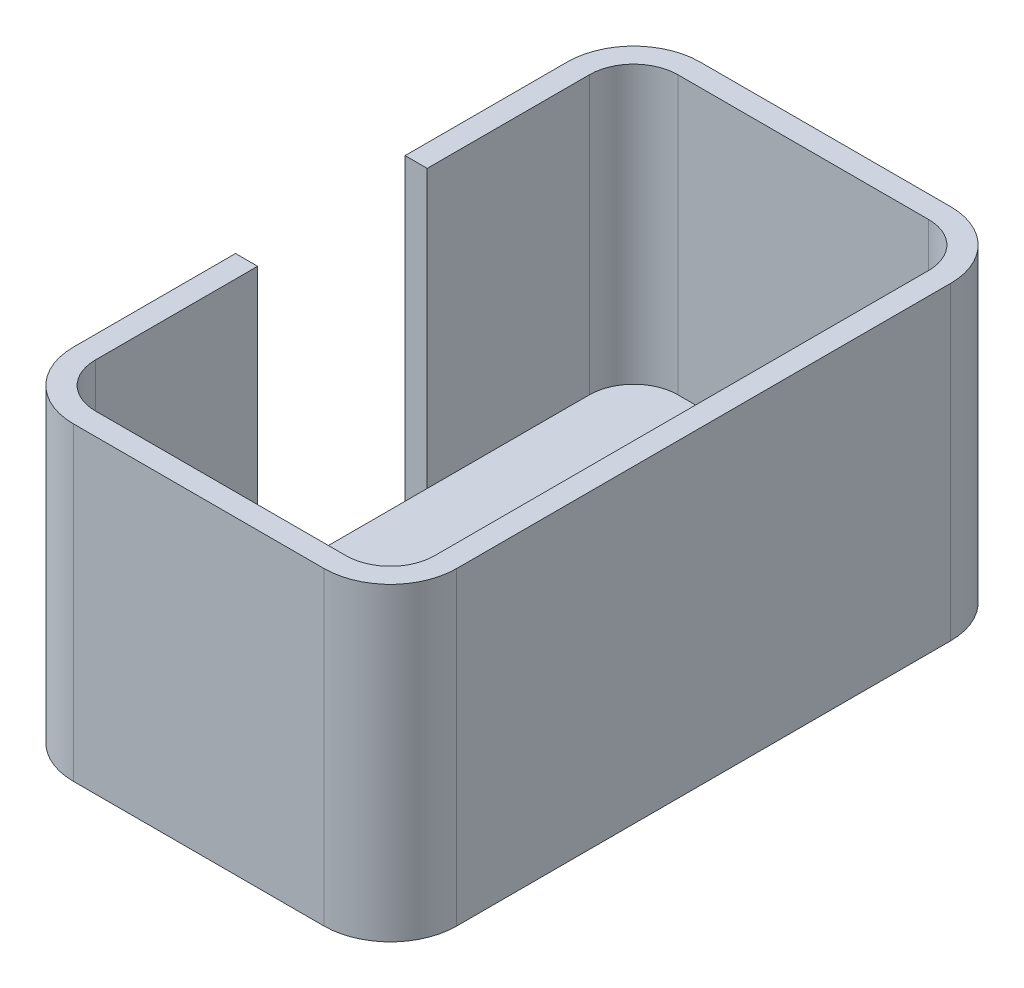
ISO-10303-21;
HEADER;
FILE_DESCRIPTION(('STEP AP214'),'2;1');
FILE_NAME('part.step','',(''),(''),'','','');
FILE_SCHEMA(('AUTOMOTIVE_DESIGN { 1 0 10303 214 1 1 1 1 }'));
ENDSEC;
DATA;
#1=APPLICATION_CONTEXT('core data for automotive mechanical design processes');
#2=APPLICATION_PROTOCOL_DEFINITION('international standard','automotive_design',2000,#1);
#3=PRODUCT_CONTEXT('',#1,'mechanical');
#4=PRODUCT('Part','Part','',(#3));
#5=PRODUCT_RELATED_PRODUCT_CATEGORY('part','',(#4));
#6=PRODUCT_DEFINITION_FORMATION('','',#4);
#7=PRODUCT_DEFINITION_CONTEXT('part definition',#1,'design');
#8=PRODUCT_DEFINITION('design','',#6,#7);
#9=PRODUCT_DEFINITION_SHAPE('','',#8);
#10=(LENGTH_UNIT() NAMED_UNIT(*) SI_UNIT(.MILLI.,.METRE.));
#11=(NAMED_UNIT(*) PLANE_ANGLE_UNIT() SI_UNIT($,.RADIAN.));
#12=(NAMED_UNIT(*) SI_UNIT($,.STERADIAN.) SOLID_ANGLE_UNIT());
#13=UNCERTAINTY_MEASURE_WITH_UNIT(LENGTH_MEASURE(1.E-05),#10,'distance_accuracy_value','');
#14=(GEOMETRIC_REPRESENTATION_CONTEXT(3) GLOBAL_UNCERTAINTY_ASSIGNED_CONTEXT((#13)) GLOBAL_UNIT_ASSIGNED_CONTEXT((#10,
#11,#12)) REPRESENTATION_CONTEXT('',''));
#15=CARTESIAN_POINT('',(0.,0.,0.));
#16=DIRECTION('',(0.,0.,1.));
#17=DIRECTION('',(1.,0.,0.));
#18=AXIS2_PLACEMENT_3D('',#15,#16,#17);
#19=CARTESIAN_POINT('',(-11.5,21.,-16.75));
#20=DIRECTION('',(1.,0.,0.));
#21=DIRECTION('',(0.,0.,-1.));
#22=AXIS2_PLACEMENT_3D('',#19,#20,#21);
#23=PLANE('',#22);
#24=DIRECTION('',(0.,-1.,0.));
#25=VECTOR('',#24,1.);
#26=CARTESIAN_POINT('',(-11.5,21.,-5.75));
#27=LINE('',#26,#25);
#28=CARTESIAN_POINT('',(-11.5,21.,-5.75));
#29=VERTEX_POINT('',#28);
#30=CARTESIAN_POINT('',(-11.5,2.2,-5.75));
#31=VERTEX_POINT('',#30);
#32=EDGE_CURVE('E47',#29,#31,#27,.T.);
#33=ORIENTED_EDGE('',*,*,#32,.T.);
#34=DIRECTION('',(0.,0.,1.));
#35=VECTOR('',#34,1.);
#36=CARTESIAN_POINT('',(-11.5,2.2,0.));
#37=LINE('',#36,#35);
#38=CARTESIAN_POINT('',(-11.5,2.2,-16.75));
#39=VERTEX_POINT('',#38);
#40=EDGE_CURVE('E255',#39,#31,#37,.T.);
#41=ORIENTED_EDGE('',*,*,#40,.F.);
#42=DIRECTION('',(0.,-1.,0.));
#43=VECTOR('',#42,1.);
#44=CARTESIAN_POINT('',(-11.5,21.,-16.75));
#45=LINE('',#44,#43);
#46=CARTESIAN_POINT('',(-11.5,21.,-16.75));
#47=VERTEX_POINT('',#46);
#48=EDGE_CURVE('E246',#47,#39,#45,.T.);
#49=ORIENTED_EDGE('',*,*,#48,.F.);
#50=DIRECTION('',(0.,0.,1.));
#51=VECTOR('',#50,1.);
#52=CARTESIAN_POINT('',(-11.5,21.,-16.75));
#53=LINE('',#52,#51);
#54=EDGE_CURVE('E257',#47,#29,#53,.T.);
#55=ORIENTED_EDGE('',*,*,#54,.T.);
#56=EDGE_LOOP('',(#33,#41,#49,#55));
#57=FACE_BOUND('',#56,.T.);
#58=ADVANCED_FACE('F38',(#57),#23,.T.);
#59=CARTESIAN_POINT('',(-8.5,21.,-16.75));
#60=DIRECTION('',(0.,-1.,0.));
#61=DIRECTION('',(0.,0.,-1.));
#62=AXIS2_PLACEMENT_3D('',#59,#60,#61);
#63=CYLINDRICAL_SURFACE('',#62,3.);
#64=ORIENTED_EDGE('',*,*,#48,.T.);
#65=CARTESIAN_POINT('',(-8.5,2.2,-16.75));
#66=DIRECTION('',(0.,1.,0.));
#67=DIRECTION('',(0.,0.,-1.));
#68=AXIS2_PLACEMENT_3D('',#65,#66,#67);
#69=CIRCLE('',#68,3.);
#70=CARTESIAN_POINT('',(-8.5,2.2,-19.75));
#71=VERTEX_POINT('',#70);
#72=EDGE_CURVE('E392',#71,#39,#69,.T.);
#73=ORIENTED_EDGE('',*,*,#72,.F.);
#74=DIRECTION('',(0.,-1.,0.));
#75=VECTOR('',#74,1.);
#76=CARTESIAN_POINT('',(-8.5,21.,-19.75));
#77=LINE('',#76,#75);
#78=CARTESIAN_POINT('',(-8.5,21.,-19.75));
#79=VERTEX_POINT('',#78);
#80=EDGE_CURVE('E243',#79,#71,#77,.T.);
#81=ORIENTED_EDGE('',*,*,#80,.F.);
#82=CARTESIAN_POINT('',(-8.5,21.,-16.75));
#83=DIRECTION('',(0.,1.,0.));
#84=DIRECTION('',(0.,0.,-1.));
#85=AXIS2_PLACEMENT_3D('',#82,#83,#84);
#86=CIRCLE('',#85,3.);
#87=EDGE_CURVE('E270',#79,#47,#86,.T.);
#88=ORIENTED_EDGE('',*,*,#87,.T.);
#89=EDGE_LOOP('',(#64,#73,#81,#88));
#90=FACE_BOUND('',#89,.T.);
#91=ADVANCED_FACE('F332',(#90),#63,.F.);
#92=CARTESIAN_POINT('',(-8.49999999999998,21.,-19.75));
#93=DIRECTION('',(0.,0.,1.));
#94=DIRECTION('',(1.,0.,0.));
#95=AXIS2_PLACEMENT_3D('',#92,#93,#94);
#96=PLANE('',#95);
#97=ORIENTED_EDGE('',*,*,#80,.T.);
#98=DIRECTION('',(-1.,0.,0.));
#99=VECTOR('',#98,1.);
#100=CARTESIAN_POINT('',(-8.49999999999998,2.2,-19.75));
#101=LINE('',#100,#99);
#102=CARTESIAN_POINT('',(8.49999999999998,2.2,-19.75));
#103=VERTEX_POINT('',#102);
#104=EDGE_CURVE('E387',#103,#71,#101,.T.);
#105=ORIENTED_EDGE('',*,*,#104,.F.);
#106=DIRECTION('',(0.,-1.,0.));
#107=VECTOR('',#106,1.);
#108=CARTESIAN_POINT('',(8.49999999999998,21.,-19.75));
#109=LINE('',#108,#107);
#110=CARTESIAN_POINT('',(8.49999999999998,21.,-19.75));
#111=VERTEX_POINT('',#110);
#112=EDGE_CURVE('E240',#111,#103,#109,.T.);
#113=ORIENTED_EDGE('',*,*,#112,.F.);
#114=DIRECTION('',(-1.,0.,0.));
#115=VECTOR('',#114,1.);
#116=CARTESIAN_POINT('',(-8.49999999999998,21.,-19.75));
#117=LINE('',#116,#115);
#118=EDGE_CURVE('E276',#111,#79,#117,.T.);
#119=ORIENTED_EDGE('',*,*,#118,.T.);
#120=EDGE_LOOP('',(#97,#105,#113,#119));
#121=FACE_BOUND('',#120,.T.);
#122=ADVANCED_FACE('F337',(#121),#96,.T.);
#123=CARTESIAN_POINT('',(8.5,21.,-16.75));
#124=DIRECTION('',(0.,-1.,0.));
#125=DIRECTION('',(0.,0.,-1.));
#126=AXIS2_PLACEMENT_3D('',#123,#124,#125);
#127=CYLINDRICAL_SURFACE('',#126,3.);
#128=ORIENTED_EDGE('',*,*,#112,.T.);
#129=CARTESIAN_POINT('',(8.5,2.2,-16.75));
#130=DIRECTION('',(0.,1.,0.));
#131=DIRECTION('',(0.,0.,-1.));
#132=AXIS2_PLACEMENT_3D('',#129,#130,#131);
#133=CIRCLE('',#132,3.);
#134=CARTESIAN_POINT('',(11.5,2.2,-16.75));
#135=VERTEX_POINT('',#134);
#136=EDGE_CURVE('E398',#135,#103,#133,.T.);
#137=ORIENTED_EDGE('',*,*,#136,.F.);
#138=DIRECTION('',(0.,-1.,0.));
#139=VECTOR('',#138,1.);
#140=CARTESIAN_POINT('',(11.5,21.,-16.75));
#141=LINE('',#140,#139);
#142=CARTESIAN_POINT('',(11.5,21.,-16.75));
#143=VERTEX_POINT('',#142);
#144=EDGE_CURVE('E237',#143,#135,#141,.T.);
#145=ORIENTED_EDGE('',*,*,#144,.F.);
#146=CARTESIAN_POINT('',(8.5,21.,-16.75));
#147=DIRECTION('',(0.,1.,0.));
#148=DIRECTION('',(0.,0.,-1.));
#149=AXIS2_PLACEMENT_3D('',#146,#147,#148);
#150=CIRCLE('',#149,3.);
#151=EDGE_CURVE('E279',#143,#111,#150,.T.);
#152=ORIENTED_EDGE('',*,*,#151,.T.);
#153=EDGE_LOOP('',(#128,#137,#145,#152));
#154=FACE_BOUND('',#153,.T.);
#155=ADVANCED_FACE('F375',(#154),#127,.F.);
#156=CARTESIAN_POINT('',(11.5,21.,16.75));
#157=DIRECTION('',(-1.,0.,0.));
#158=DIRECTION('',(0.,0.,1.));
#159=AXIS2_PLACEMENT_3D('',#156,#157,#158);
#160=PLANE('',#159);
#161=ORIENTED_EDGE('',*,*,#144,.T.);
#162=DIRECTION('',(0.,0.,-1.));
#163=VECTOR('',#162,1.);
#164=CARTESIAN_POINT('',(11.5,2.2,16.75));
#165=LINE('',#164,#163);
#166=CARTESIAN_POINT('',(11.5,2.2,16.75));
#167=VERTEX_POINT('',#166);
#168=EDGE_CURVE('E402',#167,#135,#165,.T.);
#169=ORIENTED_EDGE('',*,*,#168,.F.);
#170=DIRECTION('',(0.,-1.,0.));
#171=VECTOR('',#170,1.);
#172=CARTESIAN_POINT('',(11.5,21.,16.75));
#173=LINE('',#172,#171);
#174=CARTESIAN_POINT('',(11.5,21.,16.75));
#175=VERTEX_POINT('',#174);
#176=EDGE_CURVE('E234',#175,#167,#173,.T.);
#177=ORIENTED_EDGE('',*,*,#176,.F.);
#178=DIRECTION('',(0.,0.,-1.));
#179=VECTOR('',#178,1.);
#180=CARTESIAN_POINT('',(11.5,21.,16.75));
#181=LINE('',#180,#179);
#182=EDGE_CURVE('E282',#175,#143,#181,.T.);
#183=ORIENTED_EDGE('',*,*,#182,.T.);
#184=EDGE_LOOP('',(#161,#169,#177,#183));
#185=FACE_BOUND('',#184,.T.);
#186=ADVANCED_FACE('F371',(#185),#160,.T.);
#187=CARTESIAN_POINT('',(8.5,21.,16.75));
#188=DIRECTION('',(0.,-1.,0.));
#189=DIRECTION('',(0.,0.,-1.));
#190=AXIS2_PLACEMENT_3D('',#187,#188,#189);
#191=CYLINDRICAL_SURFACE('',#190,3.);
#192=ORIENTED_EDGE('',*,*,#176,.T.);
#193=CARTESIAN_POINT('',(8.5,2.2,16.75));
#194=DIRECTION('',(0.,1.,0.));
#195=DIRECTION('',(0.,0.,1.));
#196=AXIS2_PLACEMENT_3D('',#193,#194,#195);
#197=CIRCLE('',#196,3.);
#198=CARTESIAN_POINT('',(8.49999999999998,2.2,19.75));
#199=VERTEX_POINT('',#198);
#200=EDGE_CURVE('E451',#199,#167,#197,.T.);
#201=ORIENTED_EDGE('',*,*,#200,.F.);
#202=DIRECTION('',(0.,-1.,0.));
#203=VECTOR('',#202,1.);
#204=CARTESIAN_POINT('',(8.49999999999998,21.,19.75));
#205=LINE('',#204,#203);
#206=CARTESIAN_POINT('',(8.49999999999998,21.,19.75));
#207=VERTEX_POINT('',#206);
#208=EDGE_CURVE('E231',#207,#199,#205,.T.);
#209=ORIENTED_EDGE('',*,*,#208,.F.);
#210=CARTESIAN_POINT('',(8.5,21.,16.75));
#211=DIRECTION('',(0.,1.,0.));
#212=DIRECTION('',(0.,0.,1.));
#213=AXIS2_PLACEMENT_3D('',#210,#211,#212);
#214=CIRCLE('',#213,3.);
#215=EDGE_CURVE('E285',#207,#175,#214,.T.);
#216=ORIENTED_EDGE('',*,*,#215,.T.);
#217=EDGE_LOOP('',(#192,#201,#209,#216));
#218=FACE_BOUND('',#217,.T.);
#219=ADVANCED_FACE('F367',(#218),#191,.F.);
#220=CARTESIAN_POINT('',(-8.49999999999998,21.,19.75));
#221=DIRECTION('',(0.,0.,-1.));
#222=DIRECTION('',(-1.,0.,0.));
#223=AXIS2_PLACEMENT_3D('',#220,#221,#222);
#224=PLANE('',#223);
#225=ORIENTED_EDGE('',*,*,#208,.T.);
#226=DIRECTION('',(1.,0.,0.));
#227=VECTOR('',#226,1.);
#228=CARTESIAN_POINT('',(-8.49999999999998,2.2,19.75));
#229=LINE('',#228,#227);
#230=CARTESIAN_POINT('',(-8.49999999999998,2.2,19.75));
#231=VERTEX_POINT('',#230);
#232=EDGE_CURVE('E447',#231,#199,#229,.T.);
#233=ORIENTED_EDGE('',*,*,#232,.F.);
#234=DIRECTION('',(0.,-1.,0.));
#235=VECTOR('',#234,1.);
#236=CARTESIAN_POINT('',(-8.49999999999998,21.,19.75));
#237=LINE('',#236,#235);
#238=CARTESIAN_POINT('',(-8.49999999999998,21.,19.75));
#239=VERTEX_POINT('',#238);
#240=EDGE_CURVE('E228',#239,#231,#237,.T.);
#241=ORIENTED_EDGE('',*,*,#240,.F.);
#242=DIRECTION('',(1.,0.,0.));
#243=VECTOR('',#242,1.);
#244=CARTESIAN_POINT('',(-8.49999999999998,21.,19.75));
#245=LINE('',#244,#243);
#246=EDGE_CURVE('E288',#239,#207,#245,.T.);
#247=ORIENTED_EDGE('',*,*,#246,.T.);
#248=EDGE_LOOP('',(#225,#233,#241,#247));
#249=FACE_BOUND('',#248,.T.);
#250=ADVANCED_FACE('F360',(#249),#224,.T.);
#251=CARTESIAN_POINT('',(-8.5,21.,16.75));
#252=DIRECTION('',(0.,-1.,0.));
#253=DIRECTION('',(0.,0.,-1.));
#254=AXIS2_PLACEMENT_3D('',#251,#252,#253);
#255=CYLINDRICAL_SURFACE('',#254,3.);
#256=ORIENTED_EDGE('',*,*,#240,.T.);
#257=CARTESIAN_POINT('',(-8.5,2.2,16.75));
#258=DIRECTION('',(0.,1.,0.));
#259=DIRECTION('',(0.,0.,-1.));
#260=AXIS2_PLACEMENT_3D('',#257,#258,#259);
#261=CIRCLE('',#260,3.);
#262=CARTESIAN_POINT('',(-11.5,2.2,16.75));
#263=VERTEX_POINT('',#262);
#264=EDGE_CURVE('E446',#263,#231,#261,.T.);
#265=ORIENTED_EDGE('',*,*,#264,.F.);
#266=DIRECTION('',(0.,-1.,0.));
#267=VECTOR('',#266,1.);
#268=CARTESIAN_POINT('',(-11.5,21.,16.75));
#269=LINE('',#268,#267);
#270=CARTESIAN_POINT('',(-11.5,21.,16.75));
#271=VERTEX_POINT('',#270);
#272=EDGE_CURVE('E225',#271,#263,#269,.T.);
#273=ORIENTED_EDGE('',*,*,#272,.F.);
#274=CARTESIAN_POINT('',(-8.5,21.,16.75));
#275=DIRECTION('',(0.,1.,0.));
#276=DIRECTION('',(0.,0.,-1.));
#277=AXIS2_PLACEMENT_3D('',#274,#275,#276);
#278=CIRCLE('',#277,3.);
#279=EDGE_CURVE('E291',#271,#239,#278,.T.);
#280=ORIENTED_EDGE('',*,*,#279,.T.);
#281=EDGE_LOOP('',(#256,#265,#273,#280));
#282=FACE_BOUND('',#281,.T.);
#283=ADVANCED_FACE('F354',(#282),#255,.F.);
#284=CARTESIAN_POINT('',(-11.5,21.,5.75));
#285=DIRECTION('',(1.,0.,0.));
#286=DIRECTION('',(0.,0.,-1.));
#287=AXIS2_PLACEMENT_3D('',#284,#285,#286);
#288=PLANE('',#287);
#289=ORIENTED_EDGE('',*,*,#272,.T.);
#290=CARTESIAN_POINT('',(-11.5,2.2,5.75));
#291=VERTEX_POINT('',#290);
#292=EDGE_CURVE('E420',#291,#263,#37,.T.);
#293=ORIENTED_EDGE('',*,*,#292,.F.);
#294=DIRECTION('',(0.,-1.,0.));
#295=VECTOR('',#294,1.);
#296=CARTESIAN_POINT('',(-11.5,21.,5.75));
#297=LINE('',#296,#295);
#298=CARTESIAN_POINT('',(-11.5,21.,5.75));
#299=VERTEX_POINT('',#298);
#300=EDGE_CURVE('E222',#299,#291,#297,.T.);
#301=ORIENTED_EDGE('',*,*,#300,.F.);
#302=DIRECTION('',(0.,0.,1.));
#303=VECTOR('',#302,1.);
#304=CARTESIAN_POINT('',(-11.5,21.,5.75));
#305=LINE('',#304,#303);
#306=EDGE_CURVE('E294',#299,#271,#305,.T.);
#307=ORIENTED_EDGE('',*,*,#306,.T.);
#308=EDGE_LOOP('',(#289,#293,#301,#307));
#309=FACE_BOUND('',#308,.T.);
#310=ADVANCED_FACE('F350',(#309),#288,.T.);
#311=CARTESIAN_POINT('',(-13.,21.,-16.75));
#312=DIRECTION('',(1.,0.,0.));
#313=DIRECTION('',(0.,0.,-1.));
#314=AXIS2_PLACEMENT_3D('',#311,#312,#313);
#315=PLANE('',#314);
#316=DIRECTION('',(0.,0.,1.));
#317=VECTOR('',#316,1.);
#318=CARTESIAN_POINT('',(-13.,0.,-16.75));
#319=LINE('',#318,#317);
#320=CARTESIAN_POINT('',(-13.,0.,-16.75));
#321=VERTEX_POINT('',#320);
#322=CARTESIAN_POINT('',(-13.,0.,-5.75));
#323=VERTEX_POINT('',#322);
#324=EDGE_CURVE('E182',#321,#323,#319,.T.);
#325=ORIENTED_EDGE('',*,*,#324,.T.);
#326=DIRECTION('',(0.,-1.,0.));
#327=VECTOR('',#326,1.);
#328=CARTESIAN_POINT('',(-13.,21.,-5.75));
#329=LINE('',#328,#327);
#330=CARTESIAN_POINT('',(-13.,21.,-5.75));
#331=VERTEX_POINT('',#330);
#332=EDGE_CURVE('E11',#331,#323,#329,.T.);
#333=ORIENTED_EDGE('',*,*,#332,.F.);
#334=DIRECTION('',(0.,0.,1.));
#335=VECTOR('',#334,1.);
#336=CARTESIAN_POINT('',(-13.,21.,-16.75));
#337=LINE('',#336,#335);
#338=CARTESIAN_POINT('',(-13.,21.,-16.75));
#339=VERTEX_POINT('',#338);
#340=EDGE_CURVE('E105',#339,#331,#337,.T.);
#341=ORIENTED_EDGE('',*,*,#340,.F.);
#342=DIRECTION('',(0.,-1.,0.));
#343=VECTOR('',#342,1.);
#344=CARTESIAN_POINT('',(-13.,21.,-16.75));
#345=LINE('',#344,#343);
#346=EDGE_CURVE('E178',#339,#321,#345,.T.);
#347=ORIENTED_EDGE('',*,*,#346,.T.);
#348=EDGE_LOOP('',(#325,#333,#341,#347));
#349=FACE_BOUND('',#348,.T.);
#350=ADVANCED_FACE('F40',(#349),#315,.F.);
#351=CARTESIAN_POINT('',(-11.5,21.,-5.75));
#352=DIRECTION('',(0.,0.,1.));
#353=DIRECTION('',(1.,0.,0.));
#354=AXIS2_PLACEMENT_3D('',#351,#352,#353);
#355=PLANE('',#354);
#356=DIRECTION('',(-1.,0.,0.));
#357=VECTOR('',#356,1.);
#358=CARTESIAN_POINT('',(-11.5,0.,-5.75));
#359=LINE('',#358,#357);
#360=CARTESIAN_POINT('',(-11.5,0.,-5.75));
#361=VERTEX_POINT('',#360);
#362=EDGE_CURVE('E185',#361,#323,#359,.T.);
#363=ORIENTED_EDGE('',*,*,#362,.F.);
#364=DIRECTION('',(0.,1.,0.));
#365=VECTOR('',#364,1.);
#366=CARTESIAN_POINT('',(-11.5,21.,-5.75));
#367=LINE('',#366,#365);
#368=EDGE_CURVE('E186',#361,#31,#367,.T.);
#369=ORIENTED_EDGE('',*,*,#368,.T.);
#370=ORIENTED_EDGE('',*,*,#32,.F.);
#371=DIRECTION('',(-1.,0.,0.));
#372=VECTOR('',#371,1.);
#373=CARTESIAN_POINT('',(-11.5,21.,-5.75));
#374=LINE('',#373,#372);
#375=EDGE_CURVE('E265',#29,#331,#374,.T.);
#376=ORIENTED_EDGE('',*,*,#375,.T.);
#377=ORIENTED_EDGE('',*,*,#332,.T.);
#378=EDGE_LOOP('',(#363,#369,#370,#376,#377));
#379=FACE_BOUND('',#378,.T.);
#380=ADVANCED_FACE('F264',(#379),#355,.T.);
#381=CARTESIAN_POINT('',(-13.,21.,5.75));
#382=DIRECTION('',(0.,0.,-1.));
#383=DIRECTION('',(-1.,0.,0.));
#384=AXIS2_PLACEMENT_3D('',#381,#382,#383);
#385=PLANE('',#384);
#386=DIRECTION('',(1.,0.,0.));
#387=VECTOR('',#386,1.);
#388=CARTESIAN_POINT('',(-13.,0.,5.75));
#389=LINE('',#388,#387);
#390=CARTESIAN_POINT('',(-13.,0.,5.75));
#391=VERTEX_POINT('',#390);
#392=CARTESIAN_POINT('',(-11.5,0.,5.75));
#393=VERTEX_POINT('',#392);
#394=EDGE_CURVE('E189',#391,#393,#389,.T.);
#395=ORIENTED_EDGE('',*,*,#394,.F.);
#396=DIRECTION('',(0.,-1.,0.));
#397=VECTOR('',#396,1.);
#398=CARTESIAN_POINT('',(-13.,21.,5.75));
#399=LINE('',#398,#397);
#400=CARTESIAN_POINT('',(-13.,21.,5.75));
#401=VERTEX_POINT('',#400);
#402=EDGE_CURVE('E220',#401,#391,#399,.T.);
#403=ORIENTED_EDGE('',*,*,#402,.F.);
#404=DIRECTION('',(1.,0.,0.));
#405=VECTOR('',#404,1.);
#406=CARTESIAN_POINT('',(-13.,21.,5.75));
#407=LINE('',#406,#405);
#408=EDGE_CURVE('E297',#401,#299,#407,.T.);
#409=ORIENTED_EDGE('',*,*,#408,.T.);
#410=ORIENTED_EDGE('',*,*,#300,.T.);
#411=DIRECTION('',(0.,-1.,0.));
#412=VECTOR('',#411,1.);
#413=CARTESIAN_POINT('',(-11.5,21.,5.75));
#414=LINE('',#413,#412);
#415=EDGE_CURVE('E418',#291,#393,#414,.T.);
#416=ORIENTED_EDGE('',*,*,#415,.T.);
#417=EDGE_LOOP('',(#395,#403,#409,#410,#416));
#418=FACE_BOUND('',#417,.T.);
#419=ADVANCED_FACE('F342',(#418),#385,.T.);
#420=CARTESIAN_POINT('',(-13.,21.,5.75));
#421=DIRECTION('',(1.,0.,0.));
#422=DIRECTION('',(0.,0.,-1.));
#423=AXIS2_PLACEMENT_3D('',#420,#421,#422);
#424=PLANE('',#423);
#425=DIRECTION('',(0.,0.,-1.));
#426=VECTOR('',#425,1.);
#427=CARTESIAN_POINT('',(-13.,0.,5.75));
#428=LINE('',#427,#426);
#429=CARTESIAN_POINT('',(-13.,0.,16.75));
#430=VERTEX_POINT('',#429);
#431=EDGE_CURVE('E192',#391,#430,#428,.F.);
#432=ORIENTED_EDGE('',*,*,#431,.T.);
#433=DIRECTION('',(0.,-1.,0.));
#434=VECTOR('',#433,1.);
#435=CARTESIAN_POINT('',(-13.,21.,16.75));
#436=LINE('',#435,#434);
#437=CARTESIAN_POINT('',(-13.,21.,16.75));
#438=VERTEX_POINT('',#437);
#439=EDGE_CURVE('E217',#438,#430,#436,.T.);
#440=ORIENTED_EDGE('',*,*,#439,.F.);
#441=DIRECTION('',(0.,0.,-1.));
#442=VECTOR('',#441,1.);
#443=CARTESIAN_POINT('',(-13.,21.,5.75));
#444=LINE('',#443,#442);
#445=EDGE_CURVE('E300',#401,#438,#444,.F.);
#446=ORIENTED_EDGE('',*,*,#445,.F.);
#447=ORIENTED_EDGE('',*,*,#402,.T.);
#448=EDGE_LOOP('',(#432,#440,#446,#447));
#449=FACE_BOUND('',#448,.T.);
#450=ADVANCED_FACE('F347',(#449),#424,.F.);
#451=CARTESIAN_POINT('',(-8.5,21.,16.75));
#452=DIRECTION('',(0.,-1.,0.));
#453=DIRECTION('',(0.,0.,-1.));
#454=AXIS2_PLACEMENT_3D('',#451,#452,#453);
#455=CYLINDRICAL_SURFACE('',#454,4.5);
#456=CARTESIAN_POINT('',(-8.5,0.,16.75));
#457=DIRECTION('',(0.,1.,0.));
#458=DIRECTION('',(1.,0.,0.));
#459=AXIS2_PLACEMENT_3D('',#456,#457,#458);
#460=CIRCLE('',#459,4.5);
#461=CARTESIAN_POINT('',(-8.49999999999998,0.,21.25));
#462=VERTEX_POINT('',#461);
#463=EDGE_CURVE('E194',#430,#462,#460,.T.);
#464=ORIENTED_EDGE('',*,*,#463,.T.);
#465=DIRECTION('',(0.,-1.,0.));
#466=VECTOR('',#465,1.);
#467=CARTESIAN_POINT('',(-8.49999999999998,21.,21.25));
#468=LINE('',#467,#466);
#469=CARTESIAN_POINT('',(-8.49999999999998,21.,21.25));
#470=VERTEX_POINT('',#469);
#471=EDGE_CURVE('E214',#470,#462,#468,.T.);
#472=ORIENTED_EDGE('',*,*,#471,.F.);
#473=CARTESIAN_POINT('',(-8.5,21.,16.75));
#474=DIRECTION('',(0.,1.,0.));
#475=DIRECTION('',(1.,0.,0.));
#476=AXIS2_PLACEMENT_3D('',#473,#474,#475);
#477=CIRCLE('',#476,4.5);
#478=EDGE_CURVE('E302',#438,#470,#477,.T.);
#479=ORIENTED_EDGE('',*,*,#478,.F.);
#480=ORIENTED_EDGE('',*,*,#439,.T.);
#481=EDGE_LOOP('',(#464,#472,#479,#480));
#482=FACE_BOUND('',#481,.T.);
#483=ADVANCED_FACE('F432',(#482),#455,.T.);
#484=CARTESIAN_POINT('',(-8.49999999999998,21.,21.25));
#485=DIRECTION('',(0.,0.,-1.));
#486=DIRECTION('',(-1.,0.,0.));
#487=AXIS2_PLACEMENT_3D('',#484,#485,#486);
#488=PLANE('',#487);
#489=DIRECTION('',(1.,0.,0.));
#490=VECTOR('',#489,1.);
#491=CARTESIAN_POINT('',(-8.49999999999998,0.,21.25));
#492=LINE('',#491,#490);
#493=CARTESIAN_POINT('',(8.49999999999997,0.,21.25));
#494=VERTEX_POINT('',#493);
#495=EDGE_CURVE('E196',#462,#494,#492,.T.);
#496=ORIENTED_EDGE('',*,*,#495,.T.);
#497=DIRECTION('',(0.,-1.,0.));
#498=VECTOR('',#497,1.);
#499=CARTESIAN_POINT('',(8.49999999999997,21.,21.25));
#500=LINE('',#499,#498);
#501=CARTESIAN_POINT('',(8.49999999999997,21.,21.25));
#502=VERTEX_POINT('',#501);
#503=EDGE_CURVE('E211',#502,#494,#500,.T.);
#504=ORIENTED_EDGE('',*,*,#503,.F.);
#505=DIRECTION('',(1.,0.,0.));
#506=VECTOR('',#505,1.);
#507=CARTESIAN_POINT('',(-8.49999999999998,21.,21.25));
#508=LINE('',#507,#506);
#509=EDGE_CURVE('E304',#470,#502,#508,.T.);
#510=ORIENTED_EDGE('',*,*,#509,.F.);
#511=ORIENTED_EDGE('',*,*,#471,.T.);
#512=EDGE_LOOP('',(#496,#504,#510,#511));
#513=FACE_BOUND('',#512,.T.);
#514=ADVANCED_FACE('F594',(#513),#488,.F.);
#515=CARTESIAN_POINT('',(8.5,21.,16.75));
#516=DIRECTION('',(0.,-1.,0.));
#517=DIRECTION('',(0.,0.,-1.));
#518=AXIS2_PLACEMENT_3D('',#515,#516,#517);
#519=CYLINDRICAL_SURFACE('',#518,4.5);
#520=CARTESIAN_POINT('',(8.5,0.,16.75));
#521=DIRECTION('',(0.,1.,0.));
#522=DIRECTION('',(1.,0.,0.));
#523=AXIS2_PLACEMENT_3D('',#520,#521,#522);
#524=CIRCLE('',#523,4.5);
#525=CARTESIAN_POINT('',(13.,0.,16.75));
#526=VERTEX_POINT('',#525);
#527=EDGE_CURVE('E198',#494,#526,#524,.T.);
#528=ORIENTED_EDGE('',*,*,#527,.T.);
#529=DIRECTION('',(0.,-1.,0.));
#530=VECTOR('',#529,1.);
#531=CARTESIAN_POINT('',(13.,21.,16.75));
#532=LINE('',#531,#530);
#533=CARTESIAN_POINT('',(13.,21.,16.75));
#534=VERTEX_POINT('',#533);
#535=EDGE_CURVE('E208',#534,#526,#532,.T.);
#536=ORIENTED_EDGE('',*,*,#535,.F.);
#537=CARTESIAN_POINT('',(8.5,21.,16.75));
#538=DIRECTION('',(0.,1.,0.));
#539=DIRECTION('',(1.,0.,0.));
#540=AXIS2_PLACEMENT_3D('',#537,#538,#539);
#541=CIRCLE('',#540,4.5);
#542=EDGE_CURVE('E306',#502,#534,#541,.T.);
#543=ORIENTED_EDGE('',*,*,#542,.F.);
#544=ORIENTED_EDGE('',*,*,#503,.T.);
#545=EDGE_LOOP('',(#528,#536,#543,#544));
#546=FACE_BOUND('',#545,.T.);
#547=ADVANCED_FACE('F312',(#546),#519,.T.);
#548=CARTESIAN_POINT('',(13.,21.,16.75));
#549=DIRECTION('',(-1.,0.,0.));
#550=DIRECTION('',(0.,0.,1.));
#551=AXIS2_PLACEMENT_3D('',#548,#549,#550);
#552=PLANE('',#551);
#553=DIRECTION('',(0.,0.,-1.));
#554=VECTOR('',#553,1.);
#555=CARTESIAN_POINT('',(13.,0.,16.75));
#556=LINE('',#555,#554);
#557=CARTESIAN_POINT('',(13.,0.,-16.75));
#558=VERTEX_POINT('',#557);
#559=EDGE_CURVE('E200',#526,#558,#556,.T.);
#560=ORIENTED_EDGE('',*,*,#559,.T.);
#561=DIRECTION('',(0.,-1.,0.));
#562=VECTOR('',#561,1.);
#563=CARTESIAN_POINT('',(13.,21.,-16.75));
#564=LINE('',#563,#562);
#565=CARTESIAN_POINT('',(13.,21.,-16.75));
#566=VERTEX_POINT('',#565);
#567=EDGE_CURVE('E173',#566,#558,#564,.T.);
#568=ORIENTED_EDGE('',*,*,#567,.F.);
#569=DIRECTION('',(0.,0.,-1.));
#570=VECTOR('',#569,1.);
#571=CARTESIAN_POINT('',(13.,21.,16.75));
#572=LINE('',#571,#570);
#573=EDGE_CURVE('E164',#534,#566,#572,.T.);
#574=ORIENTED_EDGE('',*,*,#573,.F.);
#575=ORIENTED_EDGE('',*,*,#535,.T.);
#576=EDGE_LOOP('',(#560,#568,#574,#575));
#577=FACE_BOUND('',#576,.T.);
#578=ADVANCED_FACE('F316',(#577),#552,.F.);
#579=CARTESIAN_POINT('',(8.5,21.,-16.75));
#580=DIRECTION('',(0.,-1.,0.));
#581=DIRECTION('',(0.,0.,-1.));
#582=AXIS2_PLACEMENT_3D('',#579,#580,#581);
#583=CYLINDRICAL_SURFACE('',#582,4.5);
#584=CARTESIAN_POINT('',(8.5,0.,-16.75));
#585=DIRECTION('',(0.,1.,0.));
#586=DIRECTION('',(1.,0.,0.));
#587=AXIS2_PLACEMENT_3D('',#584,#585,#586);
#588=CIRCLE('',#587,4.5);
#589=CARTESIAN_POINT('',(8.49999999999998,0.,-21.25));
#590=VERTEX_POINT('',#589);
#591=EDGE_CURVE('E172',#558,#590,#588,.T.);
#592=ORIENTED_EDGE('',*,*,#591,.T.);
#593=DIRECTION('',(0.,-1.,0.));
#594=VECTOR('',#593,1.);
#595=CARTESIAN_POINT('',(8.49999999999998,21.,-21.25));
#596=LINE('',#595,#594);
#597=CARTESIAN_POINT('',(8.49999999999998,21.,-21.25));
#598=VERTEX_POINT('',#597);
#599=EDGE_CURVE('E169',#598,#590,#596,.T.);
#600=ORIENTED_EDGE('',*,*,#599,.F.);
#601=CARTESIAN_POINT('',(8.5,21.,-16.75));
#602=DIRECTION('',(0.,1.,0.));
#603=DIRECTION('',(1.,0.,0.));
#604=AXIS2_PLACEMENT_3D('',#601,#602,#603);
#605=CIRCLE('',#604,4.5);
#606=EDGE_CURVE('E158',#566,#598,#605,.T.);
#607=ORIENTED_EDGE('',*,*,#606,.F.);
#608=ORIENTED_EDGE('',*,*,#567,.T.);
#609=EDGE_LOOP('',(#592,#600,#607,#608));
#610=FACE_BOUND('',#609,.T.);
#611=ADVANCED_FACE('F170',(#610),#583,.T.);
#612=CARTESIAN_POINT('',(-8.49999999999998,21.,-21.25));
#613=DIRECTION('',(0.,0.,1.));
#614=DIRECTION('',(1.,0.,0.));
#615=AXIS2_PLACEMENT_3D('',#612,#613,#614);
#616=PLANE('',#615);
#617=DIRECTION('',(1.,0.,0.));
#618=VECTOR('',#617,1.);
#619=CARTESIAN_POINT('',(-8.49999999999998,0.,-21.25));
#620=LINE('',#619,#618);
#621=CARTESIAN_POINT('',(-8.5,0.,-21.25));
#622=VERTEX_POINT('',#621);
#623=EDGE_CURVE('E93',#590,#622,#620,.F.);
#624=ORIENTED_EDGE('',*,*,#623,.T.);
#625=DIRECTION('',(0.,-1.,0.));
#626=VECTOR('',#625,1.);
#627=CARTESIAN_POINT('',(-8.5,21.,-21.25));
#628=LINE('',#627,#626);
#629=CARTESIAN_POINT('',(-8.5,21.,-21.25));
#630=VERTEX_POINT('',#629);
#631=EDGE_CURVE('E174',#630,#622,#628,.T.);
#632=ORIENTED_EDGE('',*,*,#631,.F.);
#633=DIRECTION('',(1.,0.,0.));
#634=VECTOR('',#633,1.);
#635=CARTESIAN_POINT('',(-8.49999999999998,21.,-21.25));
#636=LINE('',#635,#634);
#637=EDGE_CURVE('E162',#598,#630,#636,.F.);
#638=ORIENTED_EDGE('',*,*,#637,.F.);
#639=ORIENTED_EDGE('',*,*,#599,.T.);
#640=EDGE_LOOP('',(#624,#632,#638,#639));
#641=FACE_BOUND('',#640,.T.);
#642=ADVANCED_FACE('F176',(#641),#616,.F.);
#643=CARTESIAN_POINT('',(-8.5,21.,-16.75));
#644=DIRECTION('',(0.,-1.,0.));
#645=DIRECTION('',(0.,0.,-1.));
#646=AXIS2_PLACEMENT_3D('',#643,#644,#645);
#647=CYLINDRICAL_SURFACE('',#646,4.5);
#648=CARTESIAN_POINT('',(-8.5,0.,-16.75));
#649=DIRECTION('',(0.,1.,0.));
#650=DIRECTION('',(1.,0.,0.));
#651=AXIS2_PLACEMENT_3D('',#648,#649,#650);
#652=CIRCLE('',#651,4.5);
#653=EDGE_CURVE('E99',#622,#321,#652,.T.);
#654=ORIENTED_EDGE('',*,*,#653,.T.);
#655=ORIENTED_EDGE('',*,*,#346,.F.);
#656=CARTESIAN_POINT('',(-8.5,21.,-16.75));
#657=DIRECTION('',(0.,1.,0.));
#658=DIRECTION('',(1.,0.,0.));
#659=AXIS2_PLACEMENT_3D('',#656,#657,#658);
#660=CIRCLE('',#659,4.5);
#661=EDGE_CURVE('E55',#630,#339,#660,.T.);
#662=ORIENTED_EDGE('',*,*,#661,.F.);
#663=ORIENTED_EDGE('',*,*,#631,.T.);
#664=EDGE_LOOP('',(#654,#655,#662,#663));
#665=FACE_BOUND('',#664,.T.);
#666=ADVANCED_FACE('F321',(#665),#647,.T.);
#667=CARTESIAN_POINT('',(-8.5,21.,-16.75));
#668=DIRECTION('',(0.,1.,0.));
#669=DIRECTION('',(1.,0.,0.));
#670=AXIS2_PLACEMENT_3D('',#667,#668,#669);
#671=PLANE('',#670);
#672=ORIENTED_EDGE('',*,*,#340,.T.);
#673=ORIENTED_EDGE('',*,*,#375,.F.);
#674=ORIENTED_EDGE('',*,*,#54,.F.);
#675=ORIENTED_EDGE('',*,*,#87,.F.);
#676=ORIENTED_EDGE('',*,*,#118,.F.);
#677=ORIENTED_EDGE('',*,*,#151,.F.);
#678=ORIENTED_EDGE('',*,*,#182,.F.);
#679=ORIENTED_EDGE('',*,*,#215,.F.);
#680=ORIENTED_EDGE('',*,*,#246,.F.);
#681=ORIENTED_EDGE('',*,*,#279,.F.);
#682=ORIENTED_EDGE('',*,*,#306,.F.);
#683=ORIENTED_EDGE('',*,*,#408,.F.);
#684=ORIENTED_EDGE('',*,*,#445,.T.);
#685=ORIENTED_EDGE('',*,*,#478,.T.);
#686=ORIENTED_EDGE('',*,*,#509,.T.);
#687=ORIENTED_EDGE('',*,*,#542,.T.);
#688=ORIENTED_EDGE('',*,*,#573,.T.);
#689=ORIENTED_EDGE('',*,*,#606,.T.);
#690=ORIENTED_EDGE('',*,*,#637,.T.);
#691=ORIENTED_EDGE('',*,*,#661,.T.);
#692=EDGE_LOOP('',(#672,#673,#674,#675,#676,#677,#678,#679,#680,#681,#682,#683,#684,#685,#686,
#687,#688,#689,#690,#691));
#693=FACE_BOUND('',#692,.T.);
#694=ADVANCED_FACE('F160',(#693),#671,.T.);
#695=CARTESIAN_POINT('',(-8.5,0.,-16.75));
#696=DIRECTION('',(0.,1.,0.));
#697=DIRECTION('',(1.,0.,0.));
#698=AXIS2_PLACEMENT_3D('',#695,#696,#697);
#699=PLANE('',#698);
#700=ORIENTED_EDGE('',*,*,#324,.F.);
#701=ORIENTED_EDGE('',*,*,#653,.F.);
#702=ORIENTED_EDGE('',*,*,#623,.F.);
#703=ORIENTED_EDGE('',*,*,#591,.F.);
#704=ORIENTED_EDGE('',*,*,#559,.F.);
#705=ORIENTED_EDGE('',*,*,#527,.F.);
#706=ORIENTED_EDGE('',*,*,#495,.F.);
#707=ORIENTED_EDGE('',*,*,#463,.F.);
#708=ORIENTED_EDGE('',*,*,#431,.F.);
#709=ORIENTED_EDGE('',*,*,#394,.T.);
#710=DIRECTION('',(0.,0.,1.));
#711=VECTOR('',#710,1.);
#712=CARTESIAN_POINT('',(-11.5,0.,0.));
#713=LINE('',#712,#711);
#714=EDGE_CURVE('E415',#361,#393,#713,.T.);
#715=ORIENTED_EDGE('',*,*,#714,.F.);
#716=ORIENTED_EDGE('',*,*,#362,.T.);
#717=EDGE_LOOP('',(#700,#701,#702,#703,#704,#705,#706,#707,#708,#709,#715,#716));
#718=FACE_BOUND('',#717,.T.);
#719=ADVANCED_FACE('F319',(#718),#699,.F.);
#720=CARTESIAN_POINT('',(-11.5,2.2,0.));
#721=DIRECTION('',(1.,0.,0.));
#722=DIRECTION('',(0.,0.,-1.));
#723=AXIS2_PLACEMENT_3D('',#720,#721,#722);
#724=PLANE('',#723);
#725=ORIENTED_EDGE('',*,*,#368,.F.);
#726=ORIENTED_EDGE('',*,*,#714,.T.);
#727=ORIENTED_EDGE('',*,*,#415,.F.);
#728=EDGE_CURVE('E443',#31,#291,#37,.T.);
#729=ORIENTED_EDGE('',*,*,#728,.F.);
#730=EDGE_LOOP('',(#725,#726,#727,#729));
#731=FACE_BOUND('',#730,.T.);
#732=ADVANCED_FACE('F417',(#731),#724,.F.);
#733=CARTESIAN_POINT('',(-8.5,2.2,16.75));
#734=DIRECTION('',(0.,-1.,0.));
#735=DIRECTION('',(0.,0.,-1.));
#736=AXIS2_PLACEMENT_3D('',#733,#734,#735);
#737=PLANE('',#736);
#738=ORIENTED_EDGE('',*,*,#40,.T.);
#739=ORIENTED_EDGE('',*,*,#728,.T.);
#740=ORIENTED_EDGE('',*,*,#292,.T.);
#741=ORIENTED_EDGE('',*,*,#264,.T.);
#742=ORIENTED_EDGE('',*,*,#232,.T.);
#743=ORIENTED_EDGE('',*,*,#200,.T.);
#744=ORIENTED_EDGE('',*,*,#168,.T.);
#745=ORIENTED_EDGE('',*,*,#136,.T.);
#746=ORIENTED_EDGE('',*,*,#104,.T.);
#747=ORIENTED_EDGE('',*,*,#72,.T.);
#748=EDGE_LOOP('',(#738,#739,#740,#741,#742,#743,#744,#745,#746,#747));
#749=FACE_BOUND('',#748,.T.);
#750=ADVANCED_FACE('F458',(#749),#737,.F.);
#751=CLOSED_SHELL('',(#58,#91,#122,#155,#186,#219,#250,#283,#310,#350,#380,#419,#450,#483,#514,
#547,#578,#611,#642,#666,#694,#719,#732,#750));
#752=MANIFOLD_SOLID_BREP('B2',#751);
#753=ADVANCED_BREP_SHAPE_REPRESENTATION('',(#18,#752),#14);
#754=SHAPE_DEFINITION_REPRESENTATION(#9,#753);
ENDSEC;
END-ISO-10303-21;
